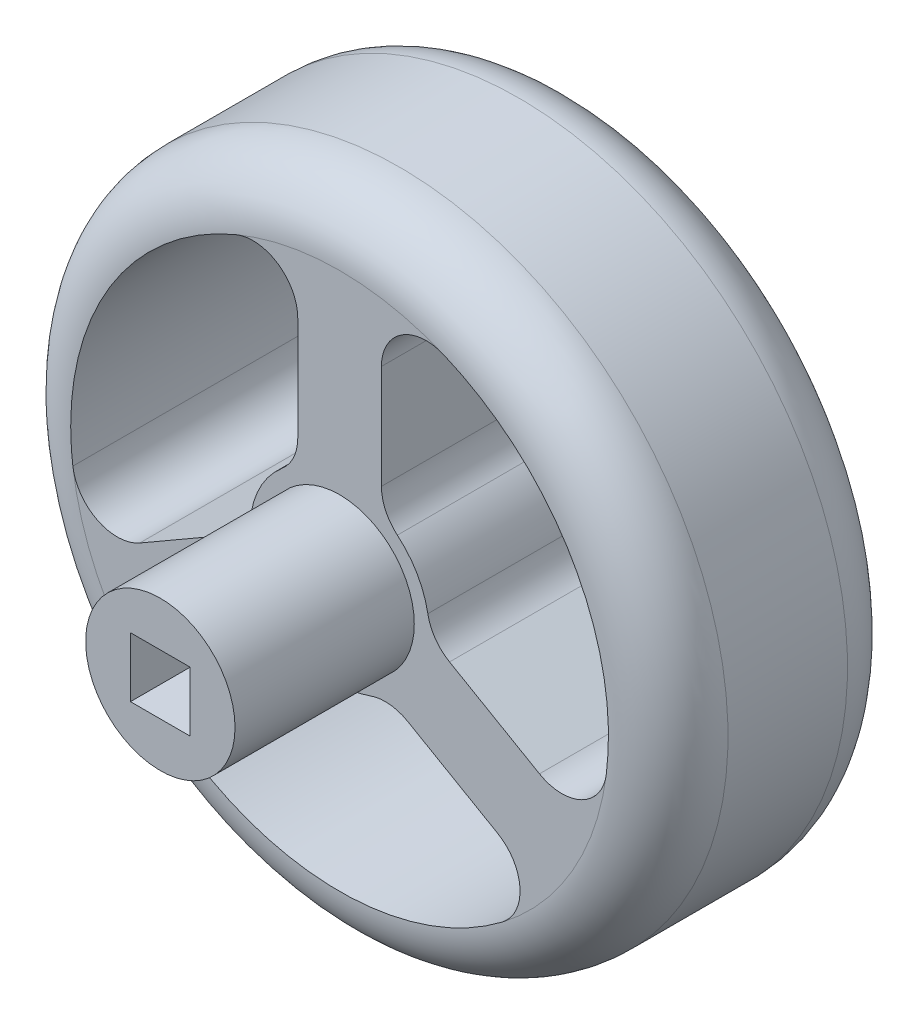
ISO-10303-21;
HEADER;
FILE_DESCRIPTION(('STEP AP214'),'2;1');
FILE_NAME('part.step','',(''),(''),'','','');
FILE_SCHEMA(('AUTOMOTIVE_DESIGN { 1 0 10303 214 1 1 1 1 }'));
ENDSEC;
DATA;
#1=APPLICATION_CONTEXT('core data for automotive mechanical design processes');
#2=APPLICATION_PROTOCOL_DEFINITION('international standard','automotive_design',2000,#1);
#3=PRODUCT_CONTEXT('',#1,'mechanical');
#4=PRODUCT('Part','Part','',(#3));
#5=PRODUCT_RELATED_PRODUCT_CATEGORY('part','',(#4));
#6=PRODUCT_DEFINITION_FORMATION('','',#4);
#7=PRODUCT_DEFINITION_CONTEXT('part definition',#1,'design');
#8=PRODUCT_DEFINITION('design','',#6,#7);
#9=PRODUCT_DEFINITION_SHAPE('','',#8);
#10=(LENGTH_UNIT() NAMED_UNIT(*) SI_UNIT(.MILLI.,.METRE.));
#11=(NAMED_UNIT(*) PLANE_ANGLE_UNIT() SI_UNIT($,.RADIAN.));
#12=(NAMED_UNIT(*) SI_UNIT($,.STERADIAN.) SOLID_ANGLE_UNIT());
#13=UNCERTAINTY_MEASURE_WITH_UNIT(LENGTH_MEASURE(1.E-05),#10,'distance_accuracy_value','');
#14=(GEOMETRIC_REPRESENTATION_CONTEXT(3) GLOBAL_UNCERTAINTY_ASSIGNED_CONTEXT((#13)) GLOBAL_UNIT_ASSIGNED_CONTEXT((#10,
#11,#12)) REPRESENTATION_CONTEXT('',''));
#15=CARTESIAN_POINT('',(0.,0.,0.));
#16=DIRECTION('',(0.,0.,1.));
#17=DIRECTION('',(1.,0.,0.));
#18=AXIS2_PLACEMENT_3D('',#15,#16,#17);
#19=CARTESIAN_POINT('',(0.,0.,-20.32));
#20=DIRECTION('',(0.,0.,1.));
#21=DIRECTION('',(1.,0.,0.));
#22=AXIS2_PLACEMENT_3D('',#19,#20,#21);
#23=CYLINDRICAL_SURFACE('',#22,6.35);
#24=CARTESIAN_POINT('',(0.,0.,-20.32));
#25=DIRECTION('',(0.,0.,-1.));
#26=DIRECTION('',(-1.,0.,0.));
#27=AXIS2_PLACEMENT_3D('',#24,#25,#26);
#28=CIRCLE('',#27,6.35);
#29=CARTESIAN_POINT('',(-6.35,0.,-20.32));
#30=VERTEX_POINT('',#29);
#31=EDGE_CURVE('E404',#30,#30,#28,.T.);
#32=ORIENTED_EDGE('',*,*,#31,.F.);
#33=EDGE_LOOP('',(#32));
#34=FACE_BOUND('',#33,.T.);
#35=CARTESIAN_POINT('',(0.,0.,-5.08));
#36=DIRECTION('',(0.,0.,1.));
#37=DIRECTION('',(1.,0.,0.));
#38=AXIS2_PLACEMENT_3D('',#35,#36,#37);
#39=CIRCLE('',#38,6.35);
#40=CARTESIAN_POINT('',(6.35,0.,-5.08));
#41=VERTEX_POINT('',#40);
#42=EDGE_CURVE('E255',#41,#41,#39,.T.);
#43=ORIENTED_EDGE('',*,*,#42,.F.);
#44=EDGE_LOOP('',(#43));
#45=FACE_BOUND('',#44,.T.);
#46=ADVANCED_FACE('F35',(#34,#45),#23,.T.);
#47=CARTESIAN_POINT('',(0.,0.,-40.64));
#48=DIRECTION('',(0.,0.,-1.));
#49=DIRECTION('',(-1.,0.,0.));
#50=AXIS2_PLACEMENT_3D('',#47,#48,#49);
#51=PLANE('',#50);
#52=CARTESIAN_POINT('',(7.366,17.5682823292432,-40.64));
#53=DIRECTION('',(0.,0.,-1.));
#54=DIRECTION('',(-1.,0.,0.));
#55=AXIS2_PLACEMENT_3D('',#52,#53,#54);
#56=CIRCLE('',#55,3.81);
#57=CARTESIAN_POINT('',(3.556,17.5682823292432,-40.64));
#58=VERTEX_POINT('',#57);
#59=CARTESIAN_POINT('',(8.8392,21.0819387950919,-40.64));
#60=VERTEX_POINT('',#59);
#61=EDGE_CURVE('E283',#58,#60,#56,.T.);
#62=ORIENTED_EDGE('',*,*,#61,.F.);
#63=DIRECTION('',(0.,1.,0.));
#64=VECTOR('',#63,1.);
#65=CARTESIAN_POINT('',(3.556,8.73996247131531,-40.64));
#66=LINE('',#65,#64);
#67=CARTESIAN_POINT('',(3.556,8.73996247131531,-40.64));
#68=VERTEX_POINT('',#67);
#69=EDGE_CURVE('E280',#68,#58,#66,.T.);
#70=ORIENTED_EDGE('',*,*,#69,.F.);
#71=CARTESIAN_POINT('',(7.366,8.73996247131531,-40.64));
#72=DIRECTION('',(0.,0.,-1.));
#73=DIRECTION('',(-1.,0.,0.));
#74=AXIS2_PLACEMENT_3D('',#71,#72,#73);
#75=CIRCLE('',#74,3.81);
#76=CARTESIAN_POINT('',(4.91066666666667,5.82664164754354,-40.64));
#77=VERTEX_POINT('',#76);
#78=EDGE_CURVE('E277',#77,#68,#75,.T.);
#79=ORIENTED_EDGE('',*,*,#78,.F.);
#80=CARTESIAN_POINT('',(0.,0.,-40.64));
#81=DIRECTION('',(0.,0.,1.));
#82=DIRECTION('',(-1.,0.,0.));
#83=AXIS2_PLACEMENT_3D('',#80,#81,#82);
#84=CIRCLE('',#83,7.62);
#85=CARTESIAN_POINT('',(7.50135301885445,1.33944125907901,-40.64));
#86=VERTEX_POINT('',#85);
#87=EDGE_CURVE('E274',#86,#77,#84,.T.);
#88=ORIENTED_EDGE('',*,*,#87,.F.);
#89=CARTESIAN_POINT('',(11.2520295282817,2.00916188861851,-40.64));
#90=DIRECTION('',(0.,0.,-1.));
#91=DIRECTION('',(-1.,0.,0.));
#92=AXIS2_PLACEMENT_3D('',#89,#90,#91);
#93=CIRCLE('',#92,3.81);
#94=CARTESIAN_POINT('',(9.34702952828168,-1.29039489980019,-40.64));
#95=VERTEX_POINT('',#94);
#96=EDGE_CURVE('E271',#95,#86,#93,.T.);
#97=ORIENTED_EDGE('',*,*,#96,.F.);
#98=DIRECTION('',(-0.866025403784438,0.5,0.));
#99=VECTOR('',#98,1.);
#100=CARTESIAN_POINT('',(9.34702952828168,-1.29039489980019,-40.64));
#101=LINE('',#100,#99);
#102=CARTESIAN_POINT('',(16.9925787979819,-5.70455482876416,-40.64));
#103=VERTEX_POINT('',#102);
#104=EDGE_CURVE('E268',#103,#95,#101,.T.);
#105=ORIENTED_EDGE('',*,*,#104,.F.);
#106=CARTESIAN_POINT('',(18.8975787979819,-2.40499804034545,-40.64));
#107=DIRECTION('',(0.,0.,-1.));
#108=DIRECTION('',(-1.,0.,0.));
#109=AXIS2_PLACEMENT_3D('',#106,#107,#108);
#110=CIRCLE('',#109,3.81);
#111=CARTESIAN_POINT('',(22.6770945575783,-2.88599764841454,-40.64));
#112=VERTEX_POINT('',#111);
#113=EDGE_CURVE('E264',#112,#103,#110,.T.);
#114=ORIENTED_EDGE('',*,*,#113,.F.);
#115=CARTESIAN_POINT('',(0.,0.,-40.64));
#116=DIRECTION('',(0.,0.,-1.));
#117=DIRECTION('',(-1.,0.,0.));
#118=AXIS2_PLACEMENT_3D('',#115,#116,#117);
#119=CIRCLE('',#118,22.86);
#120=CARTESIAN_POINT('',(13.8378945575783,-18.1959411466774,-40.64));
#121=VERTEX_POINT('',#120);
#122=EDGE_CURVE('E420',#112,#121,#119,.T.);
#123=ORIENTED_EDGE('',*,*,#122,.T.);
#124=CARTESIAN_POINT('',(11.5315787979819,-15.1632842888978,-40.64));
#125=DIRECTION('',(0.,0.,-1.));
#126=DIRECTION('',(-1.,0.,0.));
#127=AXIS2_PLACEMENT_3D('',#124,#125,#126);
#128=CIRCLE('',#127,3.81);
#129=CARTESIAN_POINT('',(13.4365787979819,-11.8637275004791,-40.64));
#130=VERTEX_POINT('',#129);
#131=EDGE_CURVE('E313',#130,#121,#128,.T.);
#132=ORIENTED_EDGE('',*,*,#131,.F.);
#133=DIRECTION('',(0.866025403784438,-0.500000000000001,0.));
#134=VECTOR('',#133,1.);
#135=CARTESIAN_POINT('',(5.79102952828168,-7.44956757151512,-40.64));
#136=LINE('',#135,#134);
#137=CARTESIAN_POINT('',(5.79102952828168,-7.44956757151512,-40.64));
#138=VERTEX_POINT('',#137);
#139=EDGE_CURVE('E310',#138,#130,#136,.T.);
#140=ORIENTED_EDGE('',*,*,#139,.F.);
#141=CARTESIAN_POINT('',(3.88602952828167,-10.7491243599338,-40.64));
#142=DIRECTION('',(0.,0.,-1.));
#143=DIRECTION('',(-1.,0.,0.));
#144=AXIS2_PLACEMENT_3D('',#141,#142,#143);
#145=CIRCLE('',#144,3.81);
#146=CARTESIAN_POINT('',(2.59068635218779,-7.16608290662255,-40.64));
#147=VERTEX_POINT('',#146);
#148=EDGE_CURVE('E307',#147,#138,#145,.T.);
#149=ORIENTED_EDGE('',*,*,#148,.F.);
#150=CARTESIAN_POINT('',(0.,0.,-40.64));
#151=DIRECTION('',(0.,0.,1.));
#152=DIRECTION('',(-1.,0.,0.));
#153=AXIS2_PLACEMENT_3D('',#150,#151,#152);
#154=CIRCLE('',#153,7.62);
#155=CARTESIAN_POINT('',(-2.59068635218779,-7.16608290662255,-40.64));
#156=VERTEX_POINT('',#155);
#157=EDGE_CURVE('E304',#156,#147,#154,.T.);
#158=ORIENTED_EDGE('',*,*,#157,.F.);
#159=CARTESIAN_POINT('',(-3.88602952828168,-10.7491243599338,-40.64));
#160=DIRECTION('',(0.,0.,-1.));
#161=DIRECTION('',(-1.,0.,0.));
#162=AXIS2_PLACEMENT_3D('',#159,#160,#161);
#163=CIRCLE('',#162,3.81);
#164=CARTESIAN_POINT('',(-5.79102952828168,-7.44956757151512,-40.64));
#165=VERTEX_POINT('',#164);
#166=EDGE_CURVE('E261',#165,#156,#163,.T.);
#167=ORIENTED_EDGE('',*,*,#166,.F.);
#168=DIRECTION('',(0.866025403784439,0.5,0.));
#169=VECTOR('',#168,1.);
#170=CARTESIAN_POINT('',(-5.79102952828168,-7.44956757151512,-40.64));
#171=LINE('',#170,#169);
#172=CARTESIAN_POINT('',(-13.4365787979819,-11.8637275004791,-40.64));
#173=VERTEX_POINT('',#172);
#174=EDGE_CURVE('E321',#173,#165,#171,.T.);
#175=ORIENTED_EDGE('',*,*,#174,.F.);
#176=CARTESIAN_POINT('',(-11.5315787979819,-15.1632842888978,-40.64));
#177=DIRECTION('',(0.,0.,-1.));
#178=DIRECTION('',(-1.,0.,0.));
#179=AXIS2_PLACEMENT_3D('',#176,#177,#178);
#180=CIRCLE('',#179,3.81);
#181=CARTESIAN_POINT('',(-13.8378945575783,-18.1959411466773,-40.64));
#182=VERTEX_POINT('',#181);
#183=EDGE_CURVE('E318',#182,#173,#180,.T.);
#184=ORIENTED_EDGE('',*,*,#183,.F.);
#185=CARTESIAN_POINT('',(-22.6770945575783,-2.88599764841453,-40.64));
#186=VERTEX_POINT('',#185);
#187=EDGE_CURVE('E414',#182,#186,#119,.T.);
#188=ORIENTED_EDGE('',*,*,#187,.T.);
#189=CARTESIAN_POINT('',(-18.8975787979819,-2.40499804034543,-40.64));
#190=DIRECTION('',(0.,0.,-1.));
#191=DIRECTION('',(-1.,0.,0.));
#192=AXIS2_PLACEMENT_3D('',#189,#190,#191);
#193=CIRCLE('',#192,3.81);
#194=CARTESIAN_POINT('',(-16.9925787979819,-5.70455482876414,-40.64));
#195=VERTEX_POINT('',#194);
#196=EDGE_CURVE('E376',#195,#186,#193,.T.);
#197=ORIENTED_EDGE('',*,*,#196,.F.);
#198=DIRECTION('',(-0.866025403784439,-0.5,0.));
#199=VECTOR('',#198,1.);
#200=CARTESIAN_POINT('',(-9.34702952828168,-1.29039489980019,-40.64));
#201=LINE('',#200,#199);
#202=CARTESIAN_POINT('',(-9.34702952828168,-1.29039489980019,-40.64));
#203=VERTEX_POINT('',#202);
#204=EDGE_CURVE('E373',#203,#195,#201,.T.);
#205=ORIENTED_EDGE('',*,*,#204,.F.);
#206=CARTESIAN_POINT('',(-11.2520295282817,2.00916188861852,-40.64));
#207=DIRECTION('',(0.,0.,-1.));
#208=DIRECTION('',(-1.,0.,0.));
#209=AXIS2_PLACEMENT_3D('',#206,#207,#208);
#210=CIRCLE('',#209,3.81);
#211=CARTESIAN_POINT('',(-7.50135301885445,1.33944125907902,-40.64));
#212=VERTEX_POINT('',#211);
#213=EDGE_CURVE('E370',#212,#203,#210,.T.);
#214=ORIENTED_EDGE('',*,*,#213,.F.);
#215=CARTESIAN_POINT('',(0.,0.,-40.64));
#216=DIRECTION('',(0.,0.,1.));
#217=DIRECTION('',(-1.,0.,0.));
#218=AXIS2_PLACEMENT_3D('',#215,#216,#217);
#219=CIRCLE('',#218,7.62);
#220=CARTESIAN_POINT('',(-4.91066666666667,5.82664164754354,-40.64));
#221=VERTEX_POINT('',#220);
#222=EDGE_CURVE('E367',#221,#212,#219,.T.);
#223=ORIENTED_EDGE('',*,*,#222,.F.);
#224=CARTESIAN_POINT('',(-7.366,8.73996247131531,-40.64));
#225=DIRECTION('',(0.,0.,-1.));
#226=DIRECTION('',(-1.,0.,0.));
#227=AXIS2_PLACEMENT_3D('',#224,#225,#226);
#228=CIRCLE('',#227,3.81);
#229=CARTESIAN_POINT('',(-3.556,8.73996247131531,-40.64));
#230=VERTEX_POINT('',#229);
#231=EDGE_CURVE('E364',#230,#221,#228,.T.);
#232=ORIENTED_EDGE('',*,*,#231,.F.);
#233=DIRECTION('',(0.,-1.,0.));
#234=VECTOR('',#233,1.);
#235=CARTESIAN_POINT('',(-3.556,8.73996247131531,-40.64));
#236=LINE('',#235,#234);
#237=CARTESIAN_POINT('',(-3.556,17.5682823292432,-40.64));
#238=VERTEX_POINT('',#237);
#239=EDGE_CURVE('E361',#238,#230,#236,.T.);
#240=ORIENTED_EDGE('',*,*,#239,.F.);
#241=CARTESIAN_POINT('',(-7.366,17.5682823292432,-40.64));
#242=DIRECTION('',(0.,0.,-1.));
#243=DIRECTION('',(-1.,0.,0.));
#244=AXIS2_PLACEMENT_3D('',#241,#242,#243);
#245=CIRCLE('',#244,3.81);
#246=CARTESIAN_POINT('',(-8.8392,21.0819387950919,-40.64));
#247=VERTEX_POINT('',#246);
#248=EDGE_CURVE('E358',#247,#238,#245,.T.);
#249=ORIENTED_EDGE('',*,*,#248,.F.);
#250=EDGE_CURVE('E416',#247,#60,#119,.T.);
#251=ORIENTED_EDGE('',*,*,#250,.T.);
#252=EDGE_LOOP('',(#62,#70,#79,#88,#97,#105,#114,#123,#132,#140,#149,#158,#167,#175,#184,#188,
#197,#205,#214,#223,#232,#240,#249,#251));
#253=FACE_BOUND('',#252,.T.);
#254=ADVANCED_FACE('F477',(#253),#51,.T.);
#255=CARTESIAN_POINT('',(0.,0.,-20.32));
#256=DIRECTION('',(0.,0.,-1.));
#257=DIRECTION('',(-1.,0.,0.));
#258=AXIS2_PLACEMENT_3D('',#255,#256,#257);
#259=PLANE('',#258);
#260=ORIENTED_EDGE('',*,*,#31,.T.);
#261=EDGE_LOOP('',(#260));
#262=FACE_BOUND('',#261,.T.);
#263=DIRECTION('',(0.,1.,0.));
#264=VECTOR('',#263,1.);
#265=CARTESIAN_POINT('',(3.556,0.,-20.32));
#266=LINE('',#265,#264);
#267=CARTESIAN_POINT('',(3.556,8.73996247131531,-20.32));
#268=VERTEX_POINT('',#267);
#269=CARTESIAN_POINT('',(3.556,17.5682823292432,-20.32));
#270=VERTEX_POINT('',#269);
#271=EDGE_CURVE('E11',#268,#270,#266,.T.);
#272=ORIENTED_EDGE('',*,*,#271,.T.);
#273=CARTESIAN_POINT('',(7.366,17.5682823292432,-20.32));
#274=DIRECTION('',(0.,0.,-1.));
#275=DIRECTION('',(-1.,0.,0.));
#276=AXIS2_PLACEMENT_3D('',#273,#274,#275);
#277=CIRCLE('',#276,3.81);
#278=CARTESIAN_POINT('',(8.8392,21.0819387950919,-20.32));
#279=VERTEX_POINT('',#278);
#280=EDGE_CURVE('E350',#270,#279,#277,.T.);
#281=ORIENTED_EDGE('',*,*,#280,.T.);
#282=CARTESIAN_POINT('',(0.,0.,-20.32));
#283=DIRECTION('',(0.,0.,-1.));
#284=DIRECTION('',(-1.,0.,0.));
#285=AXIS2_PLACEMENT_3D('',#282,#283,#284);
#286=CIRCLE('',#285,22.86);
#287=CARTESIAN_POINT('',(-8.8392,21.0819387950919,-20.32));
#288=VERTEX_POINT('',#287);
#289=EDGE_CURVE('E410',#279,#288,#286,.F.);
#290=ORIENTED_EDGE('',*,*,#289,.T.);
#291=CARTESIAN_POINT('',(-7.366,17.5682823292432,-20.32));
#292=DIRECTION('',(0.,0.,-1.));
#293=DIRECTION('',(-1.,0.,0.));
#294=AXIS2_PLACEMENT_3D('',#291,#292,#293);
#295=CIRCLE('',#294,3.81);
#296=CARTESIAN_POINT('',(-3.556,17.5682823292432,-20.32));
#297=VERTEX_POINT('',#296);
#298=EDGE_CURVE('E383',#288,#297,#295,.T.);
#299=ORIENTED_EDGE('',*,*,#298,.T.);
#300=DIRECTION('',(0.,-1.,0.));
#301=VECTOR('',#300,1.);
#302=CARTESIAN_POINT('',(-3.556,0.,-20.32));
#303=LINE('',#302,#301);
#304=CARTESIAN_POINT('',(-3.556,8.73996247131531,-20.32));
#305=VERTEX_POINT('',#304);
#306=EDGE_CURVE('E423',#297,#305,#303,.T.);
#307=ORIENTED_EDGE('',*,*,#306,.T.);
#308=CARTESIAN_POINT('',(-7.366,8.73996247131531,-20.32));
#309=DIRECTION('',(0.,0.,-1.));
#310=DIRECTION('',(-1.,0.,0.));
#311=AXIS2_PLACEMENT_3D('',#308,#309,#310);
#312=CIRCLE('',#311,3.81);
#313=CARTESIAN_POINT('',(-4.91066666666667,5.82664164754354,-20.32));
#314=VERTEX_POINT('',#313);
#315=EDGE_CURVE('E426',#305,#314,#312,.T.);
#316=ORIENTED_EDGE('',*,*,#315,.T.);
#317=CARTESIAN_POINT('',(0.,0.,-20.32));
#318=DIRECTION('',(0.,0.,-1.));
#319=DIRECTION('',(-1.,0.,0.));
#320=AXIS2_PLACEMENT_3D('',#317,#318,#319);
#321=CIRCLE('',#320,7.62);
#322=CARTESIAN_POINT('',(-7.50135301885445,1.33944125907902,-20.32));
#323=VERTEX_POINT('',#322);
#324=EDGE_CURVE('E429',#314,#323,#321,.F.);
#325=ORIENTED_EDGE('',*,*,#324,.T.);
#326=CARTESIAN_POINT('',(-11.2520295282817,2.00916188861852,-20.32));
#327=DIRECTION('',(0.,0.,-1.));
#328=DIRECTION('',(-1.,0.,0.));
#329=AXIS2_PLACEMENT_3D('',#326,#327,#328);
#330=CIRCLE('',#329,3.81);
#331=CARTESIAN_POINT('',(-9.34702952828168,-1.29039489980019,-20.32));
#332=VERTEX_POINT('',#331);
#333=EDGE_CURVE('E432',#323,#332,#330,.T.);
#334=ORIENTED_EDGE('',*,*,#333,.T.);
#335=DIRECTION('',(-0.866025403784439,-0.5,0.));
#336=VECTOR('',#335,1.);
#337=CARTESIAN_POINT('',(-1.778,3.07958633585746,-20.32));
#338=LINE('',#337,#336);
#339=CARTESIAN_POINT('',(-16.9925787979819,-5.70455482876414,-20.32));
#340=VERTEX_POINT('',#339);
#341=EDGE_CURVE('E435',#332,#340,#338,.T.);
#342=ORIENTED_EDGE('',*,*,#341,.T.);
#343=CARTESIAN_POINT('',(-18.8975787979819,-2.40499804034543,-20.32));
#344=DIRECTION('',(0.,0.,-1.));
#345=DIRECTION('',(-1.,0.,0.));
#346=AXIS2_PLACEMENT_3D('',#343,#344,#345);
#347=CIRCLE('',#346,3.81);
#348=CARTESIAN_POINT('',(-22.6770945575783,-2.88599764841452,-20.32));
#349=VERTEX_POINT('',#348);
#350=EDGE_CURVE('E399',#340,#349,#347,.T.);
#351=ORIENTED_EDGE('',*,*,#350,.T.);
#352=CARTESIAN_POINT('',(-13.8378945575783,-18.1959411466773,-20.32));
#353=VERTEX_POINT('',#352);
#354=EDGE_CURVE('E411',#349,#353,#286,.F.);
#355=ORIENTED_EDGE('',*,*,#354,.T.);
#356=CARTESIAN_POINT('',(-11.5315787979819,-15.1632842888978,-20.32));
#357=DIRECTION('',(0.,0.,-1.));
#358=DIRECTION('',(-1.,0.,0.));
#359=AXIS2_PLACEMENT_3D('',#356,#357,#358);
#360=CIRCLE('',#359,3.81);
#361=CARTESIAN_POINT('',(-13.4365787979819,-11.8637275004791,-20.32));
#362=VERTEX_POINT('',#361);
#363=EDGE_CURVE('E344',#353,#362,#360,.T.);
#364=ORIENTED_EDGE('',*,*,#363,.T.);
#365=DIRECTION('',(0.866025403784439,0.5,0.));
#366=VECTOR('',#365,1.);
#367=CARTESIAN_POINT('',(1.778,-3.07958633585746,-20.32));
#368=LINE('',#367,#366);
#369=CARTESIAN_POINT('',(-5.79102952828168,-7.44956757151512,-20.32));
#370=VERTEX_POINT('',#369);
#371=EDGE_CURVE('E450',#362,#370,#368,.T.);
#372=ORIENTED_EDGE('',*,*,#371,.T.);
#373=CARTESIAN_POINT('',(-3.88602952828168,-10.7491243599338,-20.32));
#374=DIRECTION('',(0.,0.,-1.));
#375=DIRECTION('',(-1.,0.,0.));
#376=AXIS2_PLACEMENT_3D('',#373,#374,#375);
#377=CIRCLE('',#376,3.81);
#378=CARTESIAN_POINT('',(-2.59068635218779,-7.16608290662255,-20.32));
#379=VERTEX_POINT('',#378);
#380=EDGE_CURVE('E447',#370,#379,#377,.T.);
#381=ORIENTED_EDGE('',*,*,#380,.T.);
#382=CARTESIAN_POINT('',(0.,0.,-20.32));
#383=DIRECTION('',(0.,0.,-1.));
#384=DIRECTION('',(-1.,0.,0.));
#385=AXIS2_PLACEMENT_3D('',#382,#383,#384);
#386=CIRCLE('',#385,7.62);
#387=CARTESIAN_POINT('',(2.59068635218779,-7.16608290662255,-20.32));
#388=VERTEX_POINT('',#387);
#389=EDGE_CURVE('E438',#379,#388,#386,.F.);
#390=ORIENTED_EDGE('',*,*,#389,.T.);
#391=CARTESIAN_POINT('',(3.88602952828167,-10.7491243599338,-20.32));
#392=DIRECTION('',(0.,0.,-1.));
#393=DIRECTION('',(-1.,0.,0.));
#394=AXIS2_PLACEMENT_3D('',#391,#392,#393);
#395=CIRCLE('',#394,3.81);
#396=CARTESIAN_POINT('',(5.79102952828168,-7.44956757151512,-20.32));
#397=VERTEX_POINT('',#396);
#398=EDGE_CURVE('E441',#388,#397,#395,.T.);
#399=ORIENTED_EDGE('',*,*,#398,.T.);
#400=DIRECTION('',(0.866025403784438,-0.500000000000001,0.));
#401=VECTOR('',#400,1.);
#402=CARTESIAN_POINT('',(-1.778,-3.07958633585746,-20.32));
#403=LINE('',#402,#401);
#404=CARTESIAN_POINT('',(13.4365787979819,-11.8637275004791,-20.32));
#405=VERTEX_POINT('',#404);
#406=EDGE_CURVE('E444',#397,#405,#403,.T.);
#407=ORIENTED_EDGE('',*,*,#406,.T.);
#408=CARTESIAN_POINT('',(11.5315787979819,-15.1632842888978,-20.32));
#409=DIRECTION('',(0.,0.,-1.));
#410=DIRECTION('',(-1.,0.,0.));
#411=AXIS2_PLACEMENT_3D('',#408,#409,#410);
#412=CIRCLE('',#411,3.81);
#413=CARTESIAN_POINT('',(13.8378945575782,-18.1959411466774,-20.32));
#414=VERTEX_POINT('',#413);
#415=EDGE_CURVE('E288',#405,#414,#412,.T.);
#416=ORIENTED_EDGE('',*,*,#415,.T.);
#417=CARTESIAN_POINT('',(22.6770945575783,-2.88599764841454,-20.32));
#418=VERTEX_POINT('',#417);
#419=EDGE_CURVE('E415',#414,#418,#286,.F.);
#420=ORIENTED_EDGE('',*,*,#419,.T.);
#421=CARTESIAN_POINT('',(18.8975787979819,-2.40499804034545,-20.32));
#422=DIRECTION('',(0.,0.,-1.));
#423=DIRECTION('',(-1.,0.,0.));
#424=AXIS2_PLACEMENT_3D('',#421,#422,#423);
#425=CIRCLE('',#424,3.81);
#426=CARTESIAN_POINT('',(16.9925787979819,-5.70455482876416,-20.32));
#427=VERTEX_POINT('',#426);
#428=EDGE_CURVE('E347',#418,#427,#425,.T.);
#429=ORIENTED_EDGE('',*,*,#428,.T.);
#430=DIRECTION('',(-0.866025403784438,0.5,0.));
#431=VECTOR('',#430,1.);
#432=CARTESIAN_POINT('',(1.778,3.07958633585746,-20.32));
#433=LINE('',#432,#431);
#434=CARTESIAN_POINT('',(9.34702952828168,-1.29039489980019,-20.32));
#435=VERTEX_POINT('',#434);
#436=EDGE_CURVE('E453',#427,#435,#433,.T.);
#437=ORIENTED_EDGE('',*,*,#436,.T.);
#438=CARTESIAN_POINT('',(11.2520295282817,2.00916188861851,-20.32));
#439=DIRECTION('',(0.,0.,-1.));
#440=DIRECTION('',(-1.,0.,0.));
#441=AXIS2_PLACEMENT_3D('',#438,#439,#440);
#442=CIRCLE('',#441,3.81);
#443=CARTESIAN_POINT('',(7.50135301885445,1.33944125907901,-20.32));
#444=VERTEX_POINT('',#443);
#445=EDGE_CURVE('E456',#435,#444,#442,.T.);
#446=ORIENTED_EDGE('',*,*,#445,.T.);
#447=CARTESIAN_POINT('',(0.,0.,-20.32));
#448=DIRECTION('',(0.,0.,-1.));
#449=DIRECTION('',(-1.,0.,0.));
#450=AXIS2_PLACEMENT_3D('',#447,#448,#449);
#451=CIRCLE('',#450,7.62);
#452=CARTESIAN_POINT('',(4.91066666666667,5.82664164754354,-20.32));
#453=VERTEX_POINT('',#452);
#454=EDGE_CURVE('E459',#444,#453,#451,.F.);
#455=ORIENTED_EDGE('',*,*,#454,.T.);
#456=CARTESIAN_POINT('',(7.366,8.73996247131531,-20.32));
#457=DIRECTION('',(0.,0.,-1.));
#458=DIRECTION('',(-1.,0.,0.));
#459=AXIS2_PLACEMENT_3D('',#456,#457,#458);
#460=CIRCLE('',#459,3.81);
#461=EDGE_CURVE('E43',#453,#268,#460,.T.);
#462=ORIENTED_EDGE('',*,*,#461,.T.);
#463=EDGE_LOOP('',(#272,#281,#290,#299,#307,#316,#325,#334,#342,#351,#355,#364,#372,#381,#390,
#399,#407,#416,#420,#429,#437,#446,#455,#462));
#464=FACE_BOUND('',#463,.T.);
#465=ADVANCED_FACE('F463',(#262,#464),#259,.F.);
#466=CARTESIAN_POINT('',(0.,0.,-40.64));
#467=DIRECTION('',(0.,0.,1.));
#468=DIRECTION('',(1.,0.,0.));
#469=AXIS2_PLACEMENT_3D('',#466,#467,#468);
#470=CYLINDRICAL_SURFACE('',#469,27.94);
#471=CARTESIAN_POINT('',(0.,0.,-35.56));
#472=DIRECTION('',(0.,0.,-1.));
#473=DIRECTION('',(-1.,0.,0.));
#474=AXIS2_PLACEMENT_3D('',#471,#472,#473);
#475=CIRCLE('',#474,27.94);
#476=CARTESIAN_POINT('',(-27.94,0.,-35.56));
#477=VERTEX_POINT('',#476);
#478=EDGE_CURVE('E419',#477,#477,#475,.F.);
#479=ORIENTED_EDGE('',*,*,#478,.T.);
#480=EDGE_LOOP('',(#479));
#481=FACE_BOUND('',#480,.T.);
#482=CARTESIAN_POINT('',(0.,0.,-25.4));
#483=DIRECTION('',(0.,0.,-1.));
#484=DIRECTION('',(-1.,0.,0.));
#485=AXIS2_PLACEMENT_3D('',#482,#483,#484);
#486=CIRCLE('',#485,27.94);
#487=CARTESIAN_POINT('',(-27.94,0.,-25.4));
#488=VERTEX_POINT('',#487);
#489=EDGE_CURVE('E407',#488,#488,#486,.T.);
#490=ORIENTED_EDGE('',*,*,#489,.T.);
#491=EDGE_LOOP('',(#490));
#492=FACE_BOUND('',#491,.T.);
#493=ADVANCED_FACE('F555',(#481,#492),#470,.T.);
#494=CARTESIAN_POINT('',(0.,0.,-25.4));
#495=DIRECTION('',(0.,0.,-1.));
#496=DIRECTION('',(-1.,0.,0.));
#497=AXIS2_PLACEMENT_3D('',#494,#495,#496);
#498=TOROIDAL_SURFACE('',#497,22.86,5.08);
#499=ORIENTED_EDGE('',*,*,#354,.F.);
#500=CARTESIAN_POINT('',(0.,0.,-20.32));
#501=DIRECTION('',(0.,0.,-1.));
#502=DIRECTION('',(-1.,0.,0.));
#503=AXIS2_PLACEMENT_3D('',#500,#501,#502);
#504=CIRCLE('',#503,22.86);
#505=EDGE_CURVE('E402',#288,#349,#504,.F.);
#506=ORIENTED_EDGE('',*,*,#505,.F.);
#507=ORIENTED_EDGE('',*,*,#289,.F.);
#508=CARTESIAN_POINT('',(0.,0.,-20.32));
#509=DIRECTION('',(0.,0.,-1.));
#510=DIRECTION('',(-1.,0.,0.));
#511=AXIS2_PLACEMENT_3D('',#508,#509,#510);
#512=CIRCLE('',#511,22.86);
#513=EDGE_CURVE('E353',#418,#279,#512,.F.);
#514=ORIENTED_EDGE('',*,*,#513,.F.);
#515=ORIENTED_EDGE('',*,*,#419,.F.);
#516=CARTESIAN_POINT('',(0.,0.,-20.32));
#517=DIRECTION('',(0.,0.,-1.));
#518=DIRECTION('',(-1.,0.,0.));
#519=AXIS2_PLACEMENT_3D('',#516,#517,#518);
#520=CIRCLE('',#519,22.86);
#521=EDGE_CURVE('E342',#353,#414,#520,.F.);
#522=ORIENTED_EDGE('',*,*,#521,.F.);
#523=EDGE_LOOP('',(#499,#506,#507,#514,#515,#522));
#524=FACE_BOUND('',#523,.T.);
#525=ORIENTED_EDGE('',*,*,#489,.F.);
#526=EDGE_LOOP('',(#525));
#527=FACE_BOUND('',#526,.T.);
#528=ADVANCED_FACE('F490',(#524,#527),#498,.T.);
#529=CARTESIAN_POINT('',(0.,0.,-35.56));
#530=DIRECTION('',(0.,0.,-1.));
#531=DIRECTION('',(-1.,0.,0.));
#532=AXIS2_PLACEMENT_3D('',#529,#530,#531);
#533=TOROIDAL_SURFACE('',#532,22.86,5.08);
#534=ORIENTED_EDGE('',*,*,#478,.F.);
#535=EDGE_LOOP('',(#534));
#536=FACE_BOUND('',#535,.T.);
#537=ORIENTED_EDGE('',*,*,#250,.F.);
#538=CARTESIAN_POINT('',(0.,0.,-40.64));
#539=DIRECTION('',(0.,0.,-1.));
#540=DIRECTION('',(-1.,0.,0.));
#541=AXIS2_PLACEMENT_3D('',#538,#539,#540);
#542=CIRCLE('',#541,22.86);
#543=EDGE_CURVE('E355',#186,#247,#542,.T.);
#544=ORIENTED_EDGE('',*,*,#543,.F.);
#545=ORIENTED_EDGE('',*,*,#187,.F.);
#546=CARTESIAN_POINT('',(0.,0.,-40.64));
#547=DIRECTION('',(0.,0.,-1.));
#548=DIRECTION('',(-1.,0.,0.));
#549=AXIS2_PLACEMENT_3D('',#546,#547,#548);
#550=CIRCLE('',#549,22.86);
#551=EDGE_CURVE('E315',#121,#182,#550,.T.);
#552=ORIENTED_EDGE('',*,*,#551,.F.);
#553=ORIENTED_EDGE('',*,*,#122,.F.);
#554=CARTESIAN_POINT('',(0.,0.,-40.64));
#555=DIRECTION('',(0.,0.,-1.));
#556=DIRECTION('',(-1.,0.,0.));
#557=AXIS2_PLACEMENT_3D('',#554,#555,#556);
#558=CIRCLE('',#557,22.86);
#559=EDGE_CURVE('E262',#60,#112,#558,.T.);
#560=ORIENTED_EDGE('',*,*,#559,.F.);
#561=EDGE_LOOP('',(#537,#544,#545,#552,#553,#560));
#562=FACE_BOUND('',#561,.T.);
#563=ADVANCED_FACE('F37',(#536,#562),#533,.T.);
#564=CARTESIAN_POINT('',(0.,0.,20.32));
#565=DIRECTION('',(0.,0.,-1.));
#566=DIRECTION('',(-1.,0.,0.));
#567=AXIS2_PLACEMENT_3D('',#564,#565,#566);
#568=CYLINDRICAL_SURFACE('',#567,22.86);
#569=ORIENTED_EDGE('',*,*,#505,.T.);
#570=DIRECTION('',(0.,0.,-1.));
#571=VECTOR('',#570,1.);
#572=CARTESIAN_POINT('',(-22.6770945575783,-2.88599764841452,20.32));
#573=LINE('',#572,#571);
#574=EDGE_CURVE('E380',#349,#186,#573,.T.);
#575=ORIENTED_EDGE('',*,*,#574,.T.);
#576=ORIENTED_EDGE('',*,*,#543,.T.);
#577=DIRECTION('',(0.,0.,-1.));
#578=VECTOR('',#577,1.);
#579=CARTESIAN_POINT('',(-8.8392,21.0819387950919,20.32));
#580=LINE('',#579,#578);
#581=EDGE_CURVE('E379',#288,#247,#580,.T.);
#582=ORIENTED_EDGE('',*,*,#581,.F.);
#583=EDGE_LOOP('',(#569,#575,#576,#582));
#584=FACE_BOUND('',#583,.T.);
#585=ADVANCED_FACE('F512',(#584),#568,.F.);
#586=CARTESIAN_POINT('',(-7.366,17.5682823292432,20.32));
#587=DIRECTION('',(0.,0.,-1.));
#588=DIRECTION('',(-1.,0.,0.));
#589=AXIS2_PLACEMENT_3D('',#586,#587,#588);
#590=CYLINDRICAL_SURFACE('',#589,3.81);
#591=ORIENTED_EDGE('',*,*,#581,.T.);
#592=ORIENTED_EDGE('',*,*,#248,.T.);
#593=DIRECTION('',(0.,0.,-1.));
#594=VECTOR('',#593,1.);
#595=CARTESIAN_POINT('',(-3.556,17.5682823292432,20.32));
#596=LINE('',#595,#594);
#597=EDGE_CURVE('E394',#297,#238,#596,.T.);
#598=ORIENTED_EDGE('',*,*,#597,.F.);
#599=ORIENTED_EDGE('',*,*,#298,.F.);
#600=EDGE_LOOP('',(#591,#592,#598,#599));
#601=FACE_BOUND('',#600,.T.);
#602=ADVANCED_FACE('F523',(#601),#590,.F.);
#603=CARTESIAN_POINT('',(-3.556,8.73996247131531,20.32));
#604=DIRECTION('',(1.,0.,0.));
#605=DIRECTION('',(0.,0.,-1.));
#606=AXIS2_PLACEMENT_3D('',#603,#604,#605);
#607=PLANE('',#606);
#608=ORIENTED_EDGE('',*,*,#597,.T.);
#609=ORIENTED_EDGE('',*,*,#239,.T.);
#610=DIRECTION('',(0.,0.,-1.));
#611=VECTOR('',#610,1.);
#612=CARTESIAN_POINT('',(-3.556,8.73996247131531,20.32));
#613=LINE('',#612,#611);
#614=EDGE_CURVE('E392',#305,#230,#613,.T.);
#615=ORIENTED_EDGE('',*,*,#614,.F.);
#616=ORIENTED_EDGE('',*,*,#306,.F.);
#617=EDGE_LOOP('',(#608,#609,#615,#616));
#618=FACE_BOUND('',#617,.T.);
#619=ADVANCED_FACE('F527',(#618),#607,.F.);
#620=CARTESIAN_POINT('',(-7.366,8.73996247131531,20.32));
#621=DIRECTION('',(0.,0.,-1.));
#622=DIRECTION('',(-1.,0.,0.));
#623=AXIS2_PLACEMENT_3D('',#620,#621,#622);
#624=CYLINDRICAL_SURFACE('',#623,3.81);
#625=ORIENTED_EDGE('',*,*,#614,.T.);
#626=ORIENTED_EDGE('',*,*,#231,.T.);
#627=DIRECTION('',(0.,0.,-1.));
#628=VECTOR('',#627,1.);
#629=CARTESIAN_POINT('',(-4.91066666666667,5.82664164754354,20.32));
#630=LINE('',#629,#628);
#631=EDGE_CURVE('E390',#314,#221,#630,.T.);
#632=ORIENTED_EDGE('',*,*,#631,.F.);
#633=ORIENTED_EDGE('',*,*,#315,.F.);
#634=EDGE_LOOP('',(#625,#626,#632,#633));
#635=FACE_BOUND('',#634,.T.);
#636=ADVANCED_FACE('F529',(#635),#624,.F.);
#637=CARTESIAN_POINT('',(0.,0.,20.32));
#638=DIRECTION('',(0.,0.,-1.));
#639=DIRECTION('',(-1.,0.,0.));
#640=AXIS2_PLACEMENT_3D('',#637,#638,#639);
#641=CYLINDRICAL_SURFACE('',#640,7.62);
#642=ORIENTED_EDGE('',*,*,#631,.T.);
#643=ORIENTED_EDGE('',*,*,#222,.T.);
#644=DIRECTION('',(0.,0.,-1.));
#645=VECTOR('',#644,1.);
#646=CARTESIAN_POINT('',(-7.50135301885445,1.33944125907902,20.32));
#647=LINE('',#646,#645);
#648=EDGE_CURVE('E388',#323,#212,#647,.T.);
#649=ORIENTED_EDGE('',*,*,#648,.F.);
#650=ORIENTED_EDGE('',*,*,#324,.F.);
#651=EDGE_LOOP('',(#642,#643,#649,#650));
#652=FACE_BOUND('',#651,.T.);
#653=ADVANCED_FACE('F533',(#652),#641,.T.);
#654=CARTESIAN_POINT('',(-11.2520295282817,2.00916188861852,20.32));
#655=DIRECTION('',(0.,0.,-1.));
#656=DIRECTION('',(-1.,0.,0.));
#657=AXIS2_PLACEMENT_3D('',#654,#655,#656);
#658=CYLINDRICAL_SURFACE('',#657,3.81);
#659=ORIENTED_EDGE('',*,*,#648,.T.);
#660=ORIENTED_EDGE('',*,*,#213,.T.);
#661=DIRECTION('',(0.,0.,-1.));
#662=VECTOR('',#661,1.);
#663=CARTESIAN_POINT('',(-9.34702952828168,-1.29039489980019,20.32));
#664=LINE('',#663,#662);
#665=EDGE_CURVE('E386',#332,#203,#664,.T.);
#666=ORIENTED_EDGE('',*,*,#665,.F.);
#667=ORIENTED_EDGE('',*,*,#333,.F.);
#668=EDGE_LOOP('',(#659,#660,#666,#667));
#669=FACE_BOUND('',#668,.T.);
#670=ADVANCED_FACE('F536',(#669),#658,.F.);
#671=CARTESIAN_POINT('',(-9.34702952828168,-1.29039489980019,20.32));
#672=DIRECTION('',(0.5,-0.866025403784439,0.));
#673=DIRECTION('',(0.866025403784439,0.5,0.));
#674=AXIS2_PLACEMENT_3D('',#671,#672,#673);
#675=PLANE('',#674);
#676=ORIENTED_EDGE('',*,*,#665,.T.);
#677=ORIENTED_EDGE('',*,*,#204,.T.);
#678=DIRECTION('',(0.,0.,-1.));
#679=VECTOR('',#678,1.);
#680=CARTESIAN_POINT('',(-16.9925787979819,-5.70455482876414,20.32));
#681=LINE('',#680,#679);
#682=EDGE_CURVE('E384',#340,#195,#681,.T.);
#683=ORIENTED_EDGE('',*,*,#682,.F.);
#684=ORIENTED_EDGE('',*,*,#341,.F.);
#685=EDGE_LOOP('',(#676,#677,#683,#684));
#686=FACE_BOUND('',#685,.T.);
#687=ADVANCED_FACE('F503',(#686),#675,.F.);
#688=CARTESIAN_POINT('',(-18.8975787979819,-2.40499804034543,20.32));
#689=DIRECTION('',(0.,0.,-1.));
#690=DIRECTION('',(-1.,0.,0.));
#691=AXIS2_PLACEMENT_3D('',#688,#689,#690);
#692=CYLINDRICAL_SURFACE('',#691,3.81);
#693=ORIENTED_EDGE('',*,*,#682,.T.);
#694=ORIENTED_EDGE('',*,*,#196,.T.);
#695=ORIENTED_EDGE('',*,*,#574,.F.);
#696=ORIENTED_EDGE('',*,*,#350,.F.);
#697=EDGE_LOOP('',(#693,#694,#695,#696));
#698=FACE_BOUND('',#697,.T.);
#699=ADVANCED_FACE('F501',(#698),#692,.F.);
#700=CARTESIAN_POINT('',(0.,0.,20.32));
#701=DIRECTION('',(0.,0.,-1.));
#702=DIRECTION('',(-1.,0.,0.));
#703=AXIS2_PLACEMENT_3D('',#700,#701,#702);
#704=CYLINDRICAL_SURFACE('',#703,22.86);
#705=ORIENTED_EDGE('',*,*,#521,.T.);
#706=DIRECTION('',(0.,0.,-1.));
#707=VECTOR('',#706,1.);
#708=CARTESIAN_POINT('',(13.8378945575782,-18.1959411466774,20.32));
#709=LINE('',#708,#707);
#710=EDGE_CURVE('E330',#414,#121,#709,.T.);
#711=ORIENTED_EDGE('',*,*,#710,.T.);
#712=ORIENTED_EDGE('',*,*,#551,.T.);
#713=DIRECTION('',(0.,0.,-1.));
#714=VECTOR('',#713,1.);
#715=CARTESIAN_POINT('',(-13.8378945575783,-18.1959411466773,20.32));
#716=LINE('',#715,#714);
#717=EDGE_CURVE('E328',#353,#182,#716,.T.);
#718=ORIENTED_EDGE('',*,*,#717,.F.);
#719=EDGE_LOOP('',(#705,#711,#712,#718));
#720=FACE_BOUND('',#719,.T.);
#721=ADVANCED_FACE('F608',(#720),#704,.F.);
#722=CARTESIAN_POINT('',(0.,0.,20.32));
#723=DIRECTION('',(0.,0.,-1.));
#724=DIRECTION('',(-1.,0.,0.));
#725=AXIS2_PLACEMENT_3D('',#722,#723,#724);
#726=CYLINDRICAL_SURFACE('',#725,7.62);
#727=DIRECTION('',(0.,0.,-1.));
#728=VECTOR('',#727,1.);
#729=CARTESIAN_POINT('',(-2.59068635218779,-7.16608290662255,20.32));
#730=LINE('',#729,#728);
#731=EDGE_CURVE('E324',#379,#156,#730,.T.);
#732=ORIENTED_EDGE('',*,*,#731,.T.);
#733=ORIENTED_EDGE('',*,*,#157,.T.);
#734=DIRECTION('',(0.,0.,-1.));
#735=VECTOR('',#734,1.);
#736=CARTESIAN_POINT('',(2.59068635218779,-7.16608290662255,20.32));
#737=LINE('',#736,#735);
#738=EDGE_CURVE('E337',#388,#147,#737,.T.);
#739=ORIENTED_EDGE('',*,*,#738,.F.);
#740=ORIENTED_EDGE('',*,*,#389,.F.);
#741=EDGE_LOOP('',(#732,#733,#739,#740));
#742=FACE_BOUND('',#741,.T.);
#743=ADVANCED_FACE('F617',(#742),#726,.T.);
#744=CARTESIAN_POINT('',(3.88602952828167,-10.7491243599338,20.32));
#745=DIRECTION('',(0.,0.,-1.));
#746=DIRECTION('',(-1.,0.,0.));
#747=AXIS2_PLACEMENT_3D('',#744,#745,#746);
#748=CYLINDRICAL_SURFACE('',#747,3.81);
#749=ORIENTED_EDGE('',*,*,#738,.T.);
#750=ORIENTED_EDGE('',*,*,#148,.T.);
#751=DIRECTION('',(0.,0.,-1.));
#752=VECTOR('',#751,1.);
#753=CARTESIAN_POINT('',(5.79102952828168,-7.44956757151512,20.32));
#754=LINE('',#753,#752);
#755=EDGE_CURVE('E335',#397,#138,#754,.T.);
#756=ORIENTED_EDGE('',*,*,#755,.F.);
#757=ORIENTED_EDGE('',*,*,#398,.F.);
#758=EDGE_LOOP('',(#749,#750,#756,#757));
#759=FACE_BOUND('',#758,.T.);
#760=ADVANCED_FACE('F626',(#759),#748,.F.);
#761=CARTESIAN_POINT('',(5.79102952828168,-7.44956757151512,20.32));
#762=DIRECTION('',(0.500000000000001,0.866025403784438,0.));
#763=DIRECTION('',(-0.866025403784438,0.500000000000001,0.));
#764=AXIS2_PLACEMENT_3D('',#761,#762,#763);
#765=PLANE('',#764);
#766=ORIENTED_EDGE('',*,*,#755,.T.);
#767=ORIENTED_EDGE('',*,*,#139,.T.);
#768=DIRECTION('',(0.,0.,-1.));
#769=VECTOR('',#768,1.);
#770=CARTESIAN_POINT('',(13.4365787979819,-11.8637275004791,20.32));
#771=LINE('',#770,#769);
#772=EDGE_CURVE('E333',#405,#130,#771,.T.);
#773=ORIENTED_EDGE('',*,*,#772,.F.);
#774=ORIENTED_EDGE('',*,*,#406,.F.);
#775=EDGE_LOOP('',(#766,#767,#773,#774));
#776=FACE_BOUND('',#775,.T.);
#777=ADVANCED_FACE('F636',(#776),#765,.F.);
#778=CARTESIAN_POINT('',(11.5315787979819,-15.1632842888978,20.32));
#779=DIRECTION('',(0.,0.,-1.));
#780=DIRECTION('',(-1.,0.,0.));
#781=AXIS2_PLACEMENT_3D('',#778,#779,#780);
#782=CYLINDRICAL_SURFACE('',#781,3.81);
#783=ORIENTED_EDGE('',*,*,#772,.T.);
#784=ORIENTED_EDGE('',*,*,#131,.T.);
#785=ORIENTED_EDGE('',*,*,#710,.F.);
#786=ORIENTED_EDGE('',*,*,#415,.F.);
#787=EDGE_LOOP('',(#783,#784,#785,#786));
#788=FACE_BOUND('',#787,.T.);
#789=ADVANCED_FACE('F646',(#788),#782,.F.);
#790=CARTESIAN_POINT('',(-11.5315787979819,-15.1632842888978,20.32));
#791=DIRECTION('',(0.,0.,-1.));
#792=DIRECTION('',(-1.,0.,0.));
#793=AXIS2_PLACEMENT_3D('',#790,#791,#792);
#794=CYLINDRICAL_SURFACE('',#793,3.81);
#795=ORIENTED_EDGE('',*,*,#717,.T.);
#796=ORIENTED_EDGE('',*,*,#183,.T.);
#797=DIRECTION('',(0.,0.,-1.));
#798=VECTOR('',#797,1.);
#799=CARTESIAN_POINT('',(-13.4365787979819,-11.8637275004791,20.32));
#800=LINE('',#799,#798);
#801=EDGE_CURVE('E326',#362,#173,#800,.T.);
#802=ORIENTED_EDGE('',*,*,#801,.F.);
#803=ORIENTED_EDGE('',*,*,#363,.F.);
#804=EDGE_LOOP('',(#795,#796,#802,#803));
#805=FACE_BOUND('',#804,.T.);
#806=ADVANCED_FACE('F656',(#805),#794,.F.);
#807=CARTESIAN_POINT('',(-5.79102952828168,-7.44956757151512,20.32));
#808=DIRECTION('',(-0.5,0.866025403784439,0.));
#809=DIRECTION('',(-0.866025403784439,-0.5,0.));
#810=AXIS2_PLACEMENT_3D('',#807,#808,#809);
#811=PLANE('',#810);
#812=ORIENTED_EDGE('',*,*,#801,.T.);
#813=ORIENTED_EDGE('',*,*,#174,.T.);
#814=DIRECTION('',(0.,0.,-1.));
#815=VECTOR('',#814,1.);
#816=CARTESIAN_POINT('',(-5.79102952828168,-7.44956757151512,20.32));
#817=LINE('',#816,#815);
#818=EDGE_CURVE('E265',#370,#165,#817,.T.);
#819=ORIENTED_EDGE('',*,*,#818,.F.);
#820=ORIENTED_EDGE('',*,*,#371,.F.);
#821=EDGE_LOOP('',(#812,#813,#819,#820));
#822=FACE_BOUND('',#821,.T.);
#823=ADVANCED_FACE('F666',(#822),#811,.F.);
#824=CARTESIAN_POINT('',(-3.88602952828168,-10.7491243599338,20.32));
#825=DIRECTION('',(0.,0.,-1.));
#826=DIRECTION('',(-1.,0.,0.));
#827=AXIS2_PLACEMENT_3D('',#824,#825,#826);
#828=CYLINDRICAL_SURFACE('',#827,3.81);
#829=ORIENTED_EDGE('',*,*,#818,.T.);
#830=ORIENTED_EDGE('',*,*,#166,.T.);
#831=ORIENTED_EDGE('',*,*,#731,.F.);
#832=ORIENTED_EDGE('',*,*,#380,.F.);
#833=EDGE_LOOP('',(#829,#830,#831,#832));
#834=FACE_BOUND('',#833,.T.);
#835=ADVANCED_FACE('F676',(#834),#828,.F.);
#836=CARTESIAN_POINT('',(0.,0.,20.32));
#837=DIRECTION('',(0.,0.,-1.));
#838=DIRECTION('',(-1.,0.,0.));
#839=AXIS2_PLACEMENT_3D('',#836,#837,#838);
#840=CYLINDRICAL_SURFACE('',#839,22.86);
#841=ORIENTED_EDGE('',*,*,#513,.T.);
#842=DIRECTION('',(0.,0.,-1.));
#843=VECTOR('',#842,1.);
#844=CARTESIAN_POINT('',(8.8392,21.0819387950919,20.32));
#845=LINE('',#844,#843);
#846=EDGE_CURVE('E285',#279,#60,#845,.T.);
#847=ORIENTED_EDGE('',*,*,#846,.T.);
#848=ORIENTED_EDGE('',*,*,#559,.T.);
#849=DIRECTION('',(0.,0.,-1.));
#850=VECTOR('',#849,1.);
#851=CARTESIAN_POINT('',(22.6770945575783,-2.88599764841454,20.32));
#852=LINE('',#851,#850);
#853=EDGE_CURVE('E58',#418,#112,#852,.T.);
#854=ORIENTED_EDGE('',*,*,#853,.F.);
#855=EDGE_LOOP('',(#841,#847,#848,#854));
#856=FACE_BOUND('',#855,.T.);
#857=ADVANCED_FACE('F686',(#856),#840,.F.);
#858=CARTESIAN_POINT('',(18.8975787979819,-2.40499804034545,20.32));
#859=DIRECTION('',(0.,0.,-1.));
#860=DIRECTION('',(-1.,0.,0.));
#861=AXIS2_PLACEMENT_3D('',#858,#859,#860);
#862=CYLINDRICAL_SURFACE('',#861,3.81);
#863=ORIENTED_EDGE('',*,*,#853,.T.);
#864=ORIENTED_EDGE('',*,*,#113,.T.);
#865=DIRECTION('',(0.,0.,-1.));
#866=VECTOR('',#865,1.);
#867=CARTESIAN_POINT('',(16.9925787979819,-5.70455482876416,20.32));
#868=LINE('',#867,#866);
#869=EDGE_CURVE('E299',#427,#103,#868,.T.);
#870=ORIENTED_EDGE('',*,*,#869,.F.);
#871=ORIENTED_EDGE('',*,*,#428,.F.);
#872=EDGE_LOOP('',(#863,#864,#870,#871));
#873=FACE_BOUND('',#872,.T.);
#874=ADVANCED_FACE('F696',(#873),#862,.F.);
#875=CARTESIAN_POINT('',(9.34702952828168,-1.29039489980019,20.32));
#876=DIRECTION('',(-0.5,-0.866025403784438,0.));
#877=DIRECTION('',(0.866025403784438,-0.5,0.));
#878=AXIS2_PLACEMENT_3D('',#875,#876,#877);
#879=PLANE('',#878);
#880=ORIENTED_EDGE('',*,*,#869,.T.);
#881=ORIENTED_EDGE('',*,*,#104,.T.);
#882=DIRECTION('',(0.,0.,-1.));
#883=VECTOR('',#882,1.);
#884=CARTESIAN_POINT('',(9.34702952828168,-1.29039489980019,20.32));
#885=LINE('',#884,#883);
#886=EDGE_CURVE('E297',#435,#95,#885,.T.);
#887=ORIENTED_EDGE('',*,*,#886,.F.);
#888=ORIENTED_EDGE('',*,*,#436,.F.);
#889=EDGE_LOOP('',(#880,#881,#887,#888));
#890=FACE_BOUND('',#889,.T.);
#891=ADVANCED_FACE('F705',(#890),#879,.F.);
#892=CARTESIAN_POINT('',(11.2520295282817,2.00916188861851,20.32));
#893=DIRECTION('',(0.,0.,-1.));
#894=DIRECTION('',(-1.,0.,0.));
#895=AXIS2_PLACEMENT_3D('',#892,#893,#894);
#896=CYLINDRICAL_SURFACE('',#895,3.81);
#897=ORIENTED_EDGE('',*,*,#886,.T.);
#898=ORIENTED_EDGE('',*,*,#96,.T.);
#899=DIRECTION('',(0.,0.,-1.));
#900=VECTOR('',#899,1.);
#901=CARTESIAN_POINT('',(7.50135301885445,1.33944125907901,20.32));
#902=LINE('',#901,#900);
#903=EDGE_CURVE('E295',#444,#86,#902,.T.);
#904=ORIENTED_EDGE('',*,*,#903,.F.);
#905=ORIENTED_EDGE('',*,*,#445,.F.);
#906=EDGE_LOOP('',(#897,#898,#904,#905));
#907=FACE_BOUND('',#906,.T.);
#908=ADVANCED_FACE('F715',(#907),#896,.F.);
#909=CARTESIAN_POINT('',(0.,0.,20.32));
#910=DIRECTION('',(0.,0.,-1.));
#911=DIRECTION('',(-1.,0.,0.));
#912=AXIS2_PLACEMENT_3D('',#909,#910,#911);
#913=CYLINDRICAL_SURFACE('',#912,7.62);
#914=ORIENTED_EDGE('',*,*,#903,.T.);
#915=ORIENTED_EDGE('',*,*,#87,.T.);
#916=DIRECTION('',(0.,0.,-1.));
#917=VECTOR('',#916,1.);
#918=CARTESIAN_POINT('',(4.91066666666667,5.82664164754354,20.32));
#919=LINE('',#918,#917);
#920=EDGE_CURVE('E293',#453,#77,#919,.T.);
#921=ORIENTED_EDGE('',*,*,#920,.F.);
#922=ORIENTED_EDGE('',*,*,#454,.F.);
#923=EDGE_LOOP('',(#914,#915,#921,#922));
#924=FACE_BOUND('',#923,.T.);
#925=ADVANCED_FACE('F469',(#924),#913,.T.);
#926=CARTESIAN_POINT('',(7.366,8.73996247131531,20.32));
#927=DIRECTION('',(0.,0.,-1.));
#928=DIRECTION('',(-1.,0.,0.));
#929=AXIS2_PLACEMENT_3D('',#926,#927,#928);
#930=CYLINDRICAL_SURFACE('',#929,3.81);
#931=ORIENTED_EDGE('',*,*,#920,.T.);
#932=ORIENTED_EDGE('',*,*,#78,.T.);
#933=DIRECTION('',(0.,0.,-1.));
#934=VECTOR('',#933,1.);
#935=CARTESIAN_POINT('',(3.556,8.73996247131531,20.32));
#936=LINE('',#935,#934);
#937=EDGE_CURVE('E291',#268,#68,#936,.T.);
#938=ORIENTED_EDGE('',*,*,#937,.F.);
#939=ORIENTED_EDGE('',*,*,#461,.F.);
#940=EDGE_LOOP('',(#931,#932,#938,#939));
#941=FACE_BOUND('',#940,.T.);
#942=ADVANCED_FACE('F467',(#941),#930,.F.);
#943=CARTESIAN_POINT('',(3.556,8.73996247131531,20.32));
#944=DIRECTION('',(-1.,0.,0.));
#945=DIRECTION('',(0.,0.,1.));
#946=AXIS2_PLACEMENT_3D('',#943,#944,#945);
#947=PLANE('',#946);
#948=ORIENTED_EDGE('',*,*,#937,.T.);
#949=ORIENTED_EDGE('',*,*,#69,.T.);
#950=DIRECTION('',(0.,0.,-1.));
#951=VECTOR('',#950,1.);
#952=CARTESIAN_POINT('',(3.556,17.5682823292432,20.32));
#953=LINE('',#952,#951);
#954=EDGE_CURVE('E289',#270,#58,#953,.T.);
#955=ORIENTED_EDGE('',*,*,#954,.F.);
#956=ORIENTED_EDGE('',*,*,#271,.F.);
#957=EDGE_LOOP('',(#948,#949,#955,#956));
#958=FACE_BOUND('',#957,.T.);
#959=ADVANCED_FACE('F480',(#958),#947,.F.);
#960=CARTESIAN_POINT('',(7.366,17.5682823292432,20.32));
#961=DIRECTION('',(0.,0.,-1.));
#962=DIRECTION('',(-1.,0.,0.));
#963=AXIS2_PLACEMENT_3D('',#960,#961,#962);
#964=CYLINDRICAL_SURFACE('',#963,3.81);
#965=ORIENTED_EDGE('',*,*,#954,.T.);
#966=ORIENTED_EDGE('',*,*,#61,.T.);
#967=ORIENTED_EDGE('',*,*,#846,.F.);
#968=ORIENTED_EDGE('',*,*,#280,.F.);
#969=EDGE_LOOP('',(#965,#966,#967,#968));
#970=FACE_BOUND('',#969,.T.);
#971=ADVANCED_FACE('F482',(#970),#964,.F.);
#972=CARTESIAN_POINT('',(0.,0.,-5.08));
#973=DIRECTION('',(0.,0.,1.));
#974=DIRECTION('',(1.,0.,0.));
#975=AXIS2_PLACEMENT_3D('',#972,#973,#974);
#976=PLANE('',#975);
#977=DIRECTION('',(0.,1.,0.));
#978=VECTOR('',#977,1.);
#979=CARTESIAN_POINT('',(2.54,2.54,-5.08));
#980=LINE('',#979,#978);
#981=CARTESIAN_POINT('',(2.54,-2.54,-5.08));
#982=VERTEX_POINT('',#981);
#983=CARTESIAN_POINT('',(2.54,2.54,-5.08));
#984=VERTEX_POINT('',#983);
#985=EDGE_CURVE('E50',#982,#984,#980,.T.);
#986=ORIENTED_EDGE('',*,*,#985,.F.);
#987=DIRECTION('',(1.,0.,0.));
#988=VECTOR('',#987,1.);
#989=CARTESIAN_POINT('',(-2.54,-2.54,-5.08));
#990=LINE('',#989,#988);
#991=CARTESIAN_POINT('',(-2.54,-2.54,-5.08));
#992=VERTEX_POINT('',#991);
#993=EDGE_CURVE('E240',#992,#982,#990,.T.);
#994=ORIENTED_EDGE('',*,*,#993,.F.);
#995=DIRECTION('',(0.,-1.,0.));
#996=VECTOR('',#995,1.);
#997=CARTESIAN_POINT('',(-2.54,2.54,-5.08));
#998=LINE('',#997,#996);
#999=CARTESIAN_POINT('',(-2.54,2.54,-5.08));
#1000=VERTEX_POINT('',#999);
#1001=EDGE_CURVE('E243',#1000,#992,#998,.T.);
#1002=ORIENTED_EDGE('',*,*,#1001,.F.);
#1003=DIRECTION('',(-1.,0.,0.));
#1004=VECTOR('',#1003,1.);
#1005=CARTESIAN_POINT('',(-2.54,2.54,-5.08));
#1006=LINE('',#1005,#1004);
#1007=EDGE_CURVE('E249',#984,#1000,#1006,.T.);
#1008=ORIENTED_EDGE('',*,*,#1007,.F.);
#1009=EDGE_LOOP('',(#986,#994,#1002,#1008));
#1010=FACE_BOUND('',#1009,.T.);
#1011=ORIENTED_EDGE('',*,*,#42,.T.);
#1012=EDGE_LOOP('',(#1011));
#1013=FACE_BOUND('',#1012,.T.);
#1014=ADVANCED_FACE('F757',(#1010,#1013),#976,.T.);
#1015=CARTESIAN_POINT('',(2.54,2.54,-17.78));
#1016=DIRECTION('',(1.,0.,0.));
#1017=DIRECTION('',(0.,1.,0.));
#1018=AXIS2_PLACEMENT_3D('',#1015,#1016,#1017);
#1019=PLANE('',#1018);
#1020=ORIENTED_EDGE('',*,*,#985,.T.);
#1021=DIRECTION('',(0.,0.,1.));
#1022=VECTOR('',#1021,1.);
#1023=CARTESIAN_POINT('',(2.54,2.54,-17.78));
#1024=LINE('',#1023,#1022);
#1025=CARTESIAN_POINT('',(2.54,2.54,-17.78));
#1026=VERTEX_POINT('',#1025);
#1027=EDGE_CURVE('E218',#1026,#984,#1024,.T.);
#1028=ORIENTED_EDGE('',*,*,#1027,.F.);
#1029=DIRECTION('',(0.,1.,0.));
#1030=VECTOR('',#1029,1.);
#1031=CARTESIAN_POINT('',(2.54,2.54,-17.78));
#1032=LINE('',#1031,#1030);
#1033=CARTESIAN_POINT('',(2.54,-2.54,-17.78));
#1034=VERTEX_POINT('',#1033);
#1035=EDGE_CURVE('E222',#1034,#1026,#1032,.T.);
#1036=ORIENTED_EDGE('',*,*,#1035,.F.);
#1037=DIRECTION('',(0.,0.,1.));
#1038=VECTOR('',#1037,1.);
#1039=CARTESIAN_POINT('',(2.54,-2.54,-17.78));
#1040=LINE('',#1039,#1038);
#1041=EDGE_CURVE('E253',#1034,#982,#1040,.T.);
#1042=ORIENTED_EDGE('',*,*,#1041,.T.);
#1043=EDGE_LOOP('',(#1020,#1028,#1036,#1042));
#1044=FACE_BOUND('',#1043,.T.);
#1045=ADVANCED_FACE('F220',(#1044),#1019,.F.);
#1046=CARTESIAN_POINT('',(-2.54,-2.54,-17.78));
#1047=DIRECTION('',(0.,-1.,0.));
#1048=DIRECTION('',(0.,0.,-1.));
#1049=AXIS2_PLACEMENT_3D('',#1046,#1047,#1048);
#1050=PLANE('',#1049);
#1051=ORIENTED_EDGE('',*,*,#993,.T.);
#1052=ORIENTED_EDGE('',*,*,#1041,.F.);
#1053=DIRECTION('',(1.,0.,0.));
#1054=VECTOR('',#1053,1.);
#1055=CARTESIAN_POINT('',(-2.54,-2.54,-17.78));
#1056=LINE('',#1055,#1054);
#1057=CARTESIAN_POINT('',(-2.54,-2.54,-17.78));
#1058=VERTEX_POINT('',#1057);
#1059=EDGE_CURVE('E228',#1058,#1034,#1056,.T.);
#1060=ORIENTED_EDGE('',*,*,#1059,.F.);
#1061=DIRECTION('',(0.,0.,1.));
#1062=VECTOR('',#1061,1.);
#1063=CARTESIAN_POINT('',(-2.54,-2.54,-17.78));
#1064=LINE('',#1063,#1062);
#1065=EDGE_CURVE('E256',#1058,#992,#1064,.T.);
#1066=ORIENTED_EDGE('',*,*,#1065,.T.);
#1067=EDGE_LOOP('',(#1051,#1052,#1060,#1066));
#1068=FACE_BOUND('',#1067,.T.);
#1069=ADVANCED_FACE('F780',(#1068),#1050,.F.);
#1070=CARTESIAN_POINT('',(-2.54,2.54,-17.78));
#1071=DIRECTION('',(-1.,0.,0.));
#1072=DIRECTION('',(0.,-1.,0.));
#1073=AXIS2_PLACEMENT_3D('',#1070,#1071,#1072);
#1074=PLANE('',#1073);
#1075=ORIENTED_EDGE('',*,*,#1001,.T.);
#1076=ORIENTED_EDGE('',*,*,#1065,.F.);
#1077=DIRECTION('',(0.,-1.,0.));
#1078=VECTOR('',#1077,1.);
#1079=CARTESIAN_POINT('',(-2.54,2.54,-17.78));
#1080=LINE('',#1079,#1078);
#1081=CARTESIAN_POINT('',(-2.54,2.54,-17.78));
#1082=VERTEX_POINT('',#1081);
#1083=EDGE_CURVE('E236',#1082,#1058,#1080,.T.);
#1084=ORIENTED_EDGE('',*,*,#1083,.F.);
#1085=DIRECTION('',(0.,0.,1.));
#1086=VECTOR('',#1085,1.);
#1087=CARTESIAN_POINT('',(-2.54,2.54,-17.78));
#1088=LINE('',#1087,#1086);
#1089=EDGE_CURVE('E227',#1082,#1000,#1088,.T.);
#1090=ORIENTED_EDGE('',*,*,#1089,.T.);
#1091=EDGE_LOOP('',(#1075,#1076,#1084,#1090));
#1092=FACE_BOUND('',#1091,.T.);
#1093=ADVANCED_FACE('F789',(#1092),#1074,.F.);
#1094=CARTESIAN_POINT('',(-2.54,2.54,-17.78));
#1095=DIRECTION('',(0.,1.,0.));
#1096=DIRECTION('',(0.,0.,1.));
#1097=AXIS2_PLACEMENT_3D('',#1094,#1095,#1096);
#1098=PLANE('',#1097);
#1099=ORIENTED_EDGE('',*,*,#1007,.T.);
#1100=ORIENTED_EDGE('',*,*,#1089,.F.);
#1101=DIRECTION('',(-1.,0.,0.));
#1102=VECTOR('',#1101,1.);
#1103=CARTESIAN_POINT('',(-2.54,2.54,-17.78));
#1104=LINE('',#1103,#1102);
#1105=EDGE_CURVE('E231',#1026,#1082,#1104,.T.);
#1106=ORIENTED_EDGE('',*,*,#1105,.F.);
#1107=ORIENTED_EDGE('',*,*,#1027,.T.);
#1108=EDGE_LOOP('',(#1099,#1100,#1106,#1107));
#1109=FACE_BOUND('',#1108,.T.);
#1110=ADVANCED_FACE('F232',(#1109),#1098,.F.);
#1111=CARTESIAN_POINT('',(0.,0.,-17.78));
#1112=DIRECTION('',(0.,0.,1.));
#1113=DIRECTION('',(1.,0.,0.));
#1114=AXIS2_PLACEMENT_3D('',#1111,#1112,#1113);
#1115=PLANE('',#1114);
#1116=ORIENTED_EDGE('',*,*,#1035,.T.);
#1117=ORIENTED_EDGE('',*,*,#1105,.T.);
#1118=ORIENTED_EDGE('',*,*,#1083,.T.);
#1119=ORIENTED_EDGE('',*,*,#1059,.T.);
#1120=EDGE_LOOP('',(#1116,#1117,#1118,#1119));
#1121=FACE_BOUND('',#1120,.T.);
#1122=ADVANCED_FACE('F238',(#1121),#1115,.T.);
#1123=CLOSED_SHELL('',(#46,#254,#465,#493,#528,#563,#585,#602,#619,#636,#653,#670,#687,#699,
#721,#743,#760,#777,#789,#806,#823,#835,#857,#874,#891,#908,#925,#942,#959,#971,#1014,#1045,
#1069,#1093,#1110,#1122));
#1124=MANIFOLD_SOLID_BREP('B2',#1123);
#1125=ADVANCED_BREP_SHAPE_REPRESENTATION('',(#18,#1124),#14);
#1126=SHAPE_DEFINITION_REPRESENTATION(#9,#1125);
ENDSEC;
END-ISO-10303-21;
